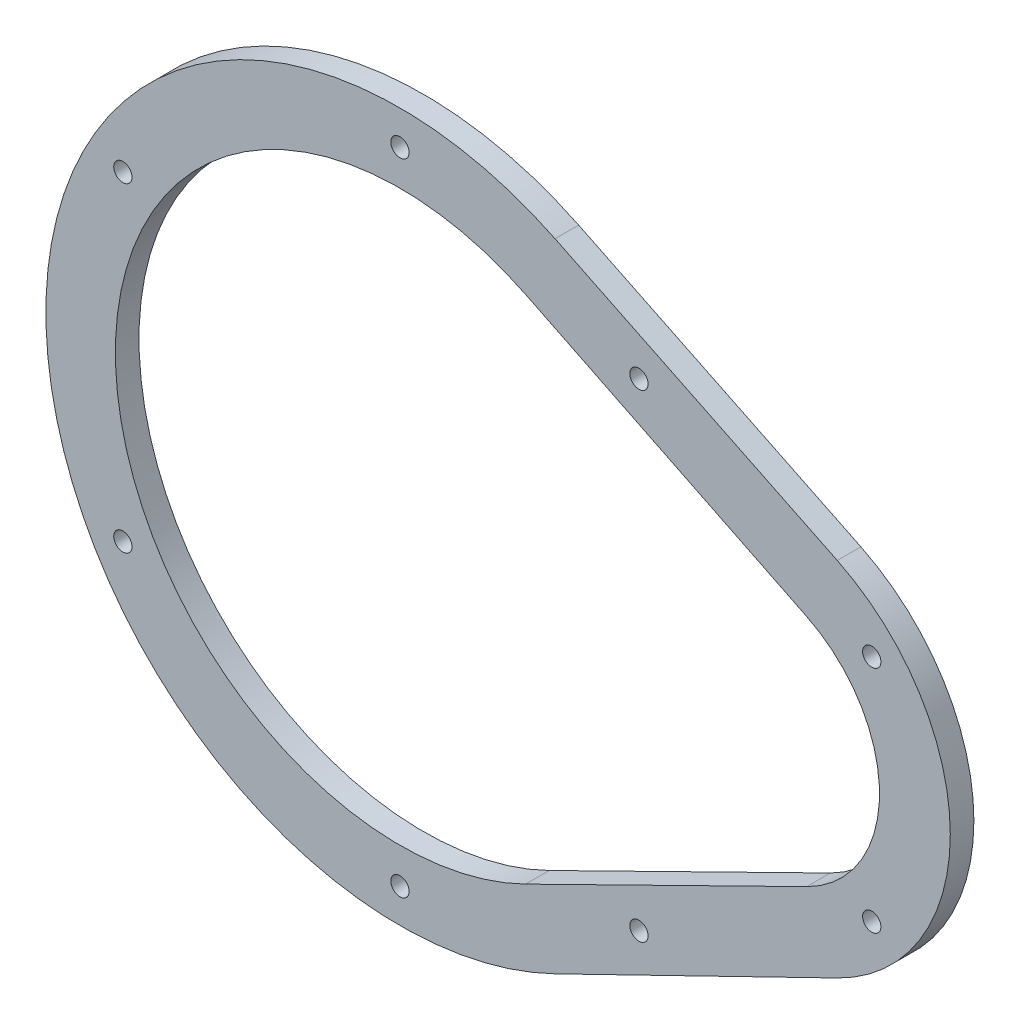
ISO-10303-21;
HEADER;
FILE_DESCRIPTION(('STEP AP214'),'2;1');
FILE_NAME('part.step','',(''),(''),'','','');
FILE_SCHEMA(('AUTOMOTIVE_DESIGN { 1 0 10303 214 1 1 1 1 }'));
ENDSEC;
DATA;
#1=APPLICATION_CONTEXT('core data for automotive mechanical design processes');
#2=APPLICATION_PROTOCOL_DEFINITION('international standard','automotive_design',2000,#1);
#3=PRODUCT_CONTEXT('',#1,'mechanical');
#4=PRODUCT('Part','Part','',(#3));
#5=PRODUCT_RELATED_PRODUCT_CATEGORY('part','',(#4));
#6=PRODUCT_DEFINITION_FORMATION('','',#4);
#7=PRODUCT_DEFINITION_CONTEXT('part definition',#1,'design');
#8=PRODUCT_DEFINITION('design','',#6,#7);
#9=PRODUCT_DEFINITION_SHAPE('','',#8);
#10=(LENGTH_UNIT() NAMED_UNIT(*) SI_UNIT(.MILLI.,.METRE.));
#11=(NAMED_UNIT(*) PLANE_ANGLE_UNIT() SI_UNIT($,.RADIAN.));
#12=(NAMED_UNIT(*) SI_UNIT($,.STERADIAN.) SOLID_ANGLE_UNIT());
#13=UNCERTAINTY_MEASURE_WITH_UNIT(LENGTH_MEASURE(1.E-05),#10,'distance_accuracy_value','');
#14=(GEOMETRIC_REPRESENTATION_CONTEXT(3) GLOBAL_UNCERTAINTY_ASSIGNED_CONTEXT((#13)) GLOBAL_UNIT_ASSIGNED_CONTEXT((#10,
#11,#12)) REPRESENTATION_CONTEXT('',''));
#15=CARTESIAN_POINT('',(0.,0.,0.));
#16=DIRECTION('',(0.,0.,1.));
#17=DIRECTION('',(1.,0.,0.));
#18=AXIS2_PLACEMENT_3D('',#15,#16,#17);
#19=CARTESIAN_POINT('',(0.,0.,4.));
#20=DIRECTION('',(0.,0.,1.));
#21=DIRECTION('',(1.,0.,0.));
#22=AXIS2_PLACEMENT_3D('',#19,#20,#21);
#23=PLANE('',#22);
#24=CARTESIAN_POINT('',(0.,54.22083333,4.));
#25=DIRECTION('',(0.,0.,1.));
#26=DIRECTION('',(1.,0.,0.));
#27=AXIS2_PLACEMENT_3D('',#24,#25,#26);
#28=CIRCLE('',#27,1.55);
#29=CARTESIAN_POINT('',(1.55,54.22083333,4.));
#30=VERTEX_POINT('',#29);
#31=EDGE_CURVE('E129',#30,#30,#28,.F.);
#32=ORIENTED_EDGE('',*,*,#31,.T.);
#33=EDGE_LOOP('',(#32));
#34=FACE_BOUND('',#33,.T.);
#35=CARTESIAN_POINT('',(40.4981886331445,-40.4981886331446,4.));
#36=DIRECTION('',(0.,0.,1.));
#37=DIRECTION('',(1.,0.,0.));
#38=AXIS2_PLACEMENT_3D('',#35,#36,#37);
#39=CIRCLE('',#38,1.55);
#40=CARTESIAN_POINT('',(42.0481886331445,-40.4981886331446,4.));
#41=VERTEX_POINT('',#40);
#42=EDGE_CURVE('E298',#41,#41,#39,.F.);
#43=ORIENTED_EDGE('',*,*,#42,.T.);
#44=EDGE_LOOP('',(#43));
#45=FACE_BOUND('',#44,.T.);
#46=CARTESIAN_POINT('',(40.4981886331445,40.4981886331446,4.));
#47=DIRECTION('',(0.,0.,1.));
#48=DIRECTION('',(1.,0.,0.));
#49=AXIS2_PLACEMENT_3D('',#46,#47,#48);
#50=CIRCLE('',#49,1.55);
#51=CARTESIAN_POINT('',(42.0481886331445,40.4981886331446,4.));
#52=VERTEX_POINT('',#51);
#53=EDGE_CURVE('E295',#52,#52,#50,.F.);
#54=ORIENTED_EDGE('',*,*,#53,.T.);
#55=EDGE_LOOP('',(#54));
#56=FACE_BOUND('',#55,.T.);
#57=CARTESIAN_POINT('',(79.94543648263,-19.4454364826301,4.));
#58=DIRECTION('',(0.,0.,1.));
#59=DIRECTION('',(1.,0.,0.));
#60=AXIS2_PLACEMENT_3D('',#57,#58,#59);
#61=CIRCLE('',#60,1.54999999999999);
#62=CARTESIAN_POINT('',(81.49543648263,-19.4454364826301,4.));
#63=VERTEX_POINT('',#62);
#64=EDGE_CURVE('E292',#63,#63,#61,.F.);
#65=ORIENTED_EDGE('',*,*,#64,.T.);
#66=EDGE_LOOP('',(#65));
#67=FACE_BOUND('',#66,.T.);
#68=CARTESIAN_POINT('',(1.94790818854248E-12,-54.2208333300005,4.));
#69=DIRECTION('',(0.,0.,1.));
#70=DIRECTION('',(1.,0.,0.));
#71=AXIS2_PLACEMENT_3D('',#68,#69,#70);
#72=CIRCLE('',#71,1.55000000000135);
#73=CARTESIAN_POINT('',(1.55000000000329,-54.2208333300005,4.));
#74=VERTEX_POINT('',#73);
#75=EDGE_CURVE('E289',#74,#74,#72,.F.);
#76=ORIENTED_EDGE('',*,*,#75,.T.);
#77=EDGE_LOOP('',(#76));
#78=FACE_BOUND('',#77,.T.);
#79=CARTESIAN_POINT('',(-46.9566190781388,-27.1104166650002,4.));
#80=DIRECTION('',(0.,0.,1.));
#81=DIRECTION('',(1.,0.,0.));
#82=AXIS2_PLACEMENT_3D('',#79,#80,#81);
#83=CIRCLE('',#82,1.55000000000226);
#84=CARTESIAN_POINT('',(-45.4066190781365,-27.1104166650002,4.));
#85=VERTEX_POINT('',#84);
#86=EDGE_CURVE('E286',#85,#85,#83,.F.);
#87=ORIENTED_EDGE('',*,*,#86,.T.);
#88=EDGE_LOOP('',(#87));
#89=FACE_BOUND('',#88,.T.);
#90=CARTESIAN_POINT('',(-46.9566190781398,27.1104166649986,4.));
#91=DIRECTION('',(0.,0.,1.));
#92=DIRECTION('',(1.,0.,0.));
#93=AXIS2_PLACEMENT_3D('',#90,#91,#92);
#94=CIRCLE('',#93,1.55000000000079);
#95=CARTESIAN_POINT('',(-45.406619078139,27.1104166649986,4.));
#96=VERTEX_POINT('',#95);
#97=EDGE_CURVE('E261',#96,#96,#94,.F.);
#98=ORIENTED_EDGE('',*,*,#97,.T.);
#99=EDGE_LOOP('',(#98));
#100=FACE_BOUND('',#99,.T.);
#101=CARTESIAN_POINT('',(79.94543648263,19.4454364826301,4.));
#102=DIRECTION('',(0.,0.,1.));
#103=DIRECTION('',(1.,0.,0.));
#104=AXIS2_PLACEMENT_3D('',#101,#102,#103);
#105=CIRCLE('',#104,1.54999999999999);
#106=CARTESIAN_POINT('',(81.49543648263,19.4454364826301,4.));
#107=VERTEX_POINT('',#106);
#108=EDGE_CURVE('E257',#107,#107,#105,.F.);
#109=ORIENTED_EDGE('',*,*,#108,.T.);
#110=EDGE_LOOP('',(#109));
#111=FACE_BOUND('',#110,.T.);
#112=CARTESIAN_POINT('',(0.,0.,4.));
#113=DIRECTION('',(0.,0.,1.));
#114=DIRECTION('',(1.,0.,0.));
#115=AXIS2_PLACEMENT_3D('',#112,#113,#114);
#116=CIRCLE('',#115,60.);
#117=CARTESIAN_POINT('',(26.2809917355372,53.9380151043457,4.));
#118=VERTEX_POINT('',#117);
#119=CARTESIAN_POINT('',(26.2809917355372,-53.9380151043457,4.));
#120=VERTEX_POINT('',#119);
#121=EDGE_CURVE('E139',#118,#120,#116,.T.);
#122=ORIENTED_EDGE('',*,*,#121,.T.);
#123=DIRECTION('',(0.898966918405762,0.43801652892562,0.));
#124=VECTOR('',#123,1.);
#125=CARTESIAN_POINT('',(26.2809917355372,-53.9380151043457,4.));
#126=LINE('',#125,#124);
#127=CARTESIAN_POINT('',(74.1027662046278,-30.6371269057431,4.));
#128=VERTEX_POINT('',#127);
#129=EDGE_CURVE('E142',#120,#128,#126,.T.);
#130=ORIENTED_EDGE('',*,*,#129,.T.);
#131=CARTESIAN_POINT('',(59.1750000001653,0.,4.));
#132=DIRECTION('',(0.,0.,1.));
#133=DIRECTION('',(-1.,0.,0.));
#134=AXIS2_PLACEMENT_3D('',#131,#132,#133);
#135=CIRCLE('',#134,34.080371900754);
#136=CARTESIAN_POINT('',(74.1027662046278,30.6371269057431,4.));
#137=VERTEX_POINT('',#136);
#138=EDGE_CURVE('E145',#128,#137,#135,.T.);
#139=ORIENTED_EDGE('',*,*,#138,.T.);
#140=DIRECTION('',(-0.898966918405761,0.43801652892562,0.));
#141=VECTOR('',#140,1.);
#142=CARTESIAN_POINT('',(26.2809917355372,53.9380151043457,4.));
#143=LINE('',#142,#141);
#144=EDGE_CURVE('E147',#137,#118,#143,.T.);
#145=ORIENTED_EDGE('',*,*,#144,.T.);
#146=EDGE_LOOP('',(#122,#130,#139,#145));
#147=FACE_BOUND('',#146,.T.);
#148=DIRECTION('',(0.897179221562907,0.441666666611571,0.));
#149=VECTOR('',#148,1.);
#150=CARTESIAN_POINT('',(21.2975347180932,-43.2627297101241,4.));
#151=LINE('',#150,#149);
#152=CARTESIAN_POINT('',(21.2975347180932,-43.2627297101241,4.));
#153=VERTEX_POINT('',#152);
#154=CARTESIAN_POINT('',(68.9293003461062,-19.8143900204236,4.));
#155=VERTEX_POINT('',#154);
#156=EDGE_CURVE('E109',#153,#155,#151,.T.);
#157=ORIENTED_EDGE('',*,*,#156,.F.);
#158=CARTESIAN_POINT('',(0.,0.,4.));
#159=DIRECTION('',(0.,0.,1.));
#160=DIRECTION('',(1.,0.,0.));
#161=AXIS2_PLACEMENT_3D('',#158,#159,#160);
#162=CIRCLE('',#161,48.22083333);
#163=CARTESIAN_POINT('',(21.2975347180932,43.2627297101241,4.));
#164=VERTEX_POINT('',#163);
#165=EDGE_CURVE('E101',#164,#153,#162,.T.);
#166=ORIENTED_EDGE('',*,*,#165,.F.);
#167=DIRECTION('',(-0.897179221562907,0.441666666611571,0.));
#168=VECTOR('',#167,1.);
#169=CARTESIAN_POINT('',(21.2975347180932,43.2627297101241,4.));
#170=LINE('',#169,#168);
#171=CARTESIAN_POINT('',(68.9293003461062,19.8143900204236,4.));
#172=VERTEX_POINT('',#171);
#173=EDGE_CURVE('E123',#172,#164,#170,.T.);
#174=ORIENTED_EDGE('',*,*,#173,.F.);
#175=CARTESIAN_POINT('',(59.1750000001653,0.,4.));
#176=DIRECTION('',(0.,0.,1.));
#177=DIRECTION('',(-1.,0.,0.));
#178=AXIS2_PLACEMENT_3D('',#175,#176,#177);
#179=CIRCLE('',#178,22.0852083331873);
#180=EDGE_CURVE('E121',#155,#172,#179,.T.);
#181=ORIENTED_EDGE('',*,*,#180,.F.);
#182=EDGE_LOOP('',(#157,#166,#174,#181));
#183=FACE_BOUND('',#182,.T.);
#184=ADVANCED_FACE('F36',(#34,#45,#56,#67,#78,#89,#100,#111,#147,#183),#23,.T.);
#185=CARTESIAN_POINT('',(0.,0.,0.));
#186=DIRECTION('',(0.,0.,1.));
#187=DIRECTION('',(1.,0.,0.));
#188=AXIS2_PLACEMENT_3D('',#185,#186,#187);
#189=PLANE('',#188);
#190=CARTESIAN_POINT('',(0.,54.22083333,0.));
#191=DIRECTION('',(0.,0.,1.));
#192=DIRECTION('',(1.,0.,0.));
#193=AXIS2_PLACEMENT_3D('',#190,#191,#192);
#194=CIRCLE('',#193,1.55);
#195=CARTESIAN_POINT('',(1.55,54.22083333,0.));
#196=VERTEX_POINT('',#195);
#197=EDGE_CURVE('E256',#196,#196,#194,.T.);
#198=ORIENTED_EDGE('',*,*,#197,.T.);
#199=EDGE_LOOP('',(#198));
#200=FACE_BOUND('',#199,.T.);
#201=CARTESIAN_POINT('',(40.4981886331445,-40.4981886331446,0.));
#202=DIRECTION('',(0.,0.,1.));
#203=DIRECTION('',(-1.,0.,0.));
#204=AXIS2_PLACEMENT_3D('',#201,#202,#203);
#205=CIRCLE('',#204,1.55);
#206=CARTESIAN_POINT('',(38.9481886331445,-40.4981886331446,0.));
#207=VERTEX_POINT('',#206);
#208=EDGE_CURVE('E274',#207,#207,#205,.T.);
#209=ORIENTED_EDGE('',*,*,#208,.T.);
#210=EDGE_LOOP('',(#209));
#211=FACE_BOUND('',#210,.T.);
#212=CARTESIAN_POINT('',(40.4981886331445,40.4981886331446,0.));
#213=DIRECTION('',(0.,0.,1.));
#214=DIRECTION('',(1.,0.,0.));
#215=AXIS2_PLACEMENT_3D('',#212,#213,#214);
#216=CIRCLE('',#215,1.55);
#217=CARTESIAN_POINT('',(42.0481886331445,40.4981886331446,0.));
#218=VERTEX_POINT('',#217);
#219=EDGE_CURVE('E271',#218,#218,#216,.T.);
#220=ORIENTED_EDGE('',*,*,#219,.T.);
#221=EDGE_LOOP('',(#220));
#222=FACE_BOUND('',#221,.T.);
#223=CARTESIAN_POINT('',(79.94543648263,-19.4454364826301,0.));
#224=DIRECTION('',(0.,0.,1.));
#225=DIRECTION('',(-1.,0.,0.));
#226=AXIS2_PLACEMENT_3D('',#223,#224,#225);
#227=CIRCLE('',#226,1.54999999999999);
#228=CARTESIAN_POINT('',(78.39543648263,-19.4454364826301,0.));
#229=VERTEX_POINT('',#228);
#230=EDGE_CURVE('E267',#229,#229,#227,.T.);
#231=ORIENTED_EDGE('',*,*,#230,.T.);
#232=EDGE_LOOP('',(#231));
#233=FACE_BOUND('',#232,.T.);
#234=CARTESIAN_POINT('',(1.94790818854248E-12,-54.2208333300005,0.));
#235=DIRECTION('',(0.,0.,1.));
#236=DIRECTION('',(1.,0.,0.));
#237=AXIS2_PLACEMENT_3D('',#234,#235,#236);
#238=CIRCLE('',#237,1.55000000000135);
#239=CARTESIAN_POINT('',(1.55000000000329,-54.2208333300005,0.));
#240=VERTEX_POINT('',#239);
#241=EDGE_CURVE('E270',#240,#240,#238,.T.);
#242=ORIENTED_EDGE('',*,*,#241,.T.);
#243=EDGE_LOOP('',(#242));
#244=FACE_BOUND('',#243,.T.);
#245=CARTESIAN_POINT('',(-46.9566190781388,-27.1104166650002,0.));
#246=DIRECTION('',(0.,0.,1.));
#247=DIRECTION('',(1.,0.,0.));
#248=AXIS2_PLACEMENT_3D('',#245,#246,#247);
#249=CIRCLE('',#248,1.55000000000226);
#250=CARTESIAN_POINT('',(-45.4066190781365,-27.1104166650002,0.));
#251=VERTEX_POINT('',#250);
#252=EDGE_CURVE('E279',#251,#251,#249,.T.);
#253=ORIENTED_EDGE('',*,*,#252,.T.);
#254=EDGE_LOOP('',(#253));
#255=FACE_BOUND('',#254,.T.);
#256=CARTESIAN_POINT('',(-46.9566190781398,27.1104166649986,0.));
#257=DIRECTION('',(0.,0.,1.));
#258=DIRECTION('',(1.,0.,0.));
#259=AXIS2_PLACEMENT_3D('',#256,#257,#258);
#260=CIRCLE('',#259,1.55000000000079);
#261=CARTESIAN_POINT('',(-45.406619078139,27.1104166649986,0.));
#262=VERTEX_POINT('',#261);
#263=EDGE_CURVE('E264',#262,#262,#260,.T.);
#264=ORIENTED_EDGE('',*,*,#263,.T.);
#265=EDGE_LOOP('',(#264));
#266=FACE_BOUND('',#265,.T.);
#267=CARTESIAN_POINT('',(79.94543648263,19.4454364826301,0.));
#268=DIRECTION('',(0.,0.,1.));
#269=DIRECTION('',(1.,0.,0.));
#270=AXIS2_PLACEMENT_3D('',#267,#268,#269);
#271=CIRCLE('',#270,1.54999999999999);
#272=CARTESIAN_POINT('',(81.49543648263,19.4454364826301,0.));
#273=VERTEX_POINT('',#272);
#274=EDGE_CURVE('E258',#273,#273,#271,.T.);
#275=ORIENTED_EDGE('',*,*,#274,.T.);
#276=EDGE_LOOP('',(#275));
#277=FACE_BOUND('',#276,.T.);
#278=CARTESIAN_POINT('',(0.,0.,0.));
#279=DIRECTION('',(0.,0.,1.));
#280=DIRECTION('',(1.,0.,0.));
#281=AXIS2_PLACEMENT_3D('',#278,#279,#280);
#282=CIRCLE('',#281,60.);
#283=CARTESIAN_POINT('',(26.2809917355372,53.9380151043457,0.));
#284=VERTEX_POINT('',#283);
#285=CARTESIAN_POINT('',(26.2809917355372,-53.9380151043457,0.));
#286=VERTEX_POINT('',#285);
#287=EDGE_CURVE('E117',#284,#286,#282,.T.);
#288=ORIENTED_EDGE('',*,*,#287,.F.);
#289=DIRECTION('',(-0.898966918405761,0.43801652892562,0.));
#290=VECTOR('',#289,1.);
#291=CARTESIAN_POINT('',(26.2809917355372,53.9380151043457,0.));
#292=LINE('',#291,#290);
#293=CARTESIAN_POINT('',(74.1027662046278,30.6371269057431,0.));
#294=VERTEX_POINT('',#293);
#295=EDGE_CURVE('E143',#294,#284,#292,.T.);
#296=ORIENTED_EDGE('',*,*,#295,.F.);
#297=CARTESIAN_POINT('',(59.1750000001653,0.,0.));
#298=DIRECTION('',(0.,0.,1.));
#299=DIRECTION('',(-1.,0.,0.));
#300=AXIS2_PLACEMENT_3D('',#297,#298,#299);
#301=CIRCLE('',#300,34.080371900754);
#302=CARTESIAN_POINT('',(74.1027662046278,-30.6371269057431,0.));
#303=VERTEX_POINT('',#302);
#304=EDGE_CURVE('E154',#303,#294,#301,.T.);
#305=ORIENTED_EDGE('',*,*,#304,.F.);
#306=DIRECTION('',(0.898966918405762,0.43801652892562,0.));
#307=VECTOR('',#306,1.);
#308=CARTESIAN_POINT('',(26.2809917355372,-53.9380151043457,0.));
#309=LINE('',#308,#307);
#310=EDGE_CURVE('E152',#286,#303,#309,.T.);
#311=ORIENTED_EDGE('',*,*,#310,.F.);
#312=EDGE_LOOP('',(#288,#296,#305,#311));
#313=FACE_BOUND('',#312,.T.);
#314=CARTESIAN_POINT('',(0.,0.,0.));
#315=DIRECTION('',(0.,0.,1.));
#316=DIRECTION('',(1.,0.,0.));
#317=AXIS2_PLACEMENT_3D('',#314,#315,#316);
#318=CIRCLE('',#317,48.22083333);
#319=CARTESIAN_POINT('',(21.2975347180932,43.2627297101241,0.));
#320=VERTEX_POINT('',#319);
#321=CARTESIAN_POINT('',(21.2975347180932,-43.2627297101241,0.));
#322=VERTEX_POINT('',#321);
#323=EDGE_CURVE('E59',#320,#322,#318,.T.);
#324=ORIENTED_EDGE('',*,*,#323,.T.);
#325=DIRECTION('',(0.897179221562907,0.441666666611571,0.));
#326=VECTOR('',#325,1.);
#327=CARTESIAN_POINT('',(21.2975347180932,-43.2627297101241,0.));
#328=LINE('',#327,#326);
#329=CARTESIAN_POINT('',(68.9293003461062,-19.8143900204236,0.));
#330=VERTEX_POINT('',#329);
#331=EDGE_CURVE('E116',#322,#330,#328,.T.);
#332=ORIENTED_EDGE('',*,*,#331,.T.);
#333=CARTESIAN_POINT('',(59.1750000001653,0.,0.));
#334=DIRECTION('',(0.,0.,1.));
#335=DIRECTION('',(-1.,0.,0.));
#336=AXIS2_PLACEMENT_3D('',#333,#334,#335);
#337=CIRCLE('',#336,22.0852083331873);
#338=CARTESIAN_POINT('',(68.9293003461062,19.8143900204236,0.));
#339=VERTEX_POINT('',#338);
#340=EDGE_CURVE('E131',#330,#339,#337,.T.);
#341=ORIENTED_EDGE('',*,*,#340,.T.);
#342=DIRECTION('',(-0.897179221562907,0.441666666611571,0.));
#343=VECTOR('',#342,1.);
#344=CARTESIAN_POINT('',(21.2975347180932,43.2627297101241,0.));
#345=LINE('',#344,#343);
#346=EDGE_CURVE('E110',#339,#320,#345,.T.);
#347=ORIENTED_EDGE('',*,*,#346,.T.);
#348=EDGE_LOOP('',(#324,#332,#341,#347));
#349=FACE_BOUND('',#348,.T.);
#350=ADVANCED_FACE('F172',(#200,#211,#222,#233,#244,#255,#266,#277,#313,#349),#189,.F.);
#351=CARTESIAN_POINT('',(0.,0.,4.));
#352=DIRECTION('',(0.,0.,-1.));
#353=DIRECTION('',(-1.,0.,0.));
#354=AXIS2_PLACEMENT_3D('',#351,#352,#353);
#355=CYLINDRICAL_SURFACE('',#354,60.);
#356=ORIENTED_EDGE('',*,*,#287,.T.);
#357=DIRECTION('',(0.,0.,-1.));
#358=VECTOR('',#357,1.);
#359=CARTESIAN_POINT('',(26.2809917355372,-53.9380151043457,4.));
#360=LINE('',#359,#358);
#361=EDGE_CURVE('E12',#120,#286,#360,.T.);
#362=ORIENTED_EDGE('',*,*,#361,.F.);
#363=ORIENTED_EDGE('',*,*,#121,.F.);
#364=DIRECTION('',(0.,0.,-1.));
#365=VECTOR('',#364,1.);
#366=CARTESIAN_POINT('',(26.2809917355372,53.9380151043457,4.));
#367=LINE('',#366,#365);
#368=EDGE_CURVE('E149',#118,#284,#367,.T.);
#369=ORIENTED_EDGE('',*,*,#368,.T.);
#370=EDGE_LOOP('',(#356,#362,#363,#369));
#371=FACE_BOUND('',#370,.T.);
#372=ADVANCED_FACE('F38',(#371),#355,.T.);
#373=CARTESIAN_POINT('',(26.2809917355372,-53.9380151043457,4.));
#374=DIRECTION('',(-0.43801652892562,0.898966918405762,0.));
#375=DIRECTION('',(-0.898966918405762,-0.43801652892562,0.));
#376=AXIS2_PLACEMENT_3D('',#373,#374,#375);
#377=PLANE('',#376);
#378=ORIENTED_EDGE('',*,*,#310,.T.);
#379=DIRECTION('',(0.,0.,-1.));
#380=VECTOR('',#379,1.);
#381=CARTESIAN_POINT('',(74.1027662046278,-30.6371269057431,4.));
#382=LINE('',#381,#380);
#383=EDGE_CURVE('E44',#128,#303,#382,.T.);
#384=ORIENTED_EDGE('',*,*,#383,.F.);
#385=ORIENTED_EDGE('',*,*,#129,.F.);
#386=ORIENTED_EDGE('',*,*,#361,.T.);
#387=EDGE_LOOP('',(#378,#384,#385,#386));
#388=FACE_BOUND('',#387,.T.);
#389=ADVANCED_FACE('F182',(#388),#377,.F.);
#390=CARTESIAN_POINT('',(59.1750000001653,0.,4.));
#391=DIRECTION('',(0.,0.,-1.));
#392=DIRECTION('',(-1.,0.,0.));
#393=AXIS2_PLACEMENT_3D('',#390,#391,#392);
#394=CYLINDRICAL_SURFACE('',#393,34.080371900754);
#395=ORIENTED_EDGE('',*,*,#304,.T.);
#396=DIRECTION('',(0.,0.,-1.));
#397=VECTOR('',#396,1.);
#398=CARTESIAN_POINT('',(74.1027662046278,30.6371269057431,4.));
#399=LINE('',#398,#397);
#400=EDGE_CURVE('E159',#137,#294,#399,.T.);
#401=ORIENTED_EDGE('',*,*,#400,.F.);
#402=ORIENTED_EDGE('',*,*,#138,.F.);
#403=ORIENTED_EDGE('',*,*,#383,.T.);
#404=EDGE_LOOP('',(#395,#401,#402,#403));
#405=FACE_BOUND('',#404,.T.);
#406=ADVANCED_FACE('F166',(#405),#394,.T.);
#407=CARTESIAN_POINT('',(26.2809917355372,53.9380151043457,4.));
#408=DIRECTION('',(-0.43801652892562,-0.898966918405762,0.));
#409=DIRECTION('',(0.898966918405762,-0.43801652892562,0.));
#410=AXIS2_PLACEMENT_3D('',#407,#408,#409);
#411=PLANE('',#410);
#412=ORIENTED_EDGE('',*,*,#295,.T.);
#413=ORIENTED_EDGE('',*,*,#368,.F.);
#414=ORIENTED_EDGE('',*,*,#144,.F.);
#415=ORIENTED_EDGE('',*,*,#400,.T.);
#416=EDGE_LOOP('',(#412,#413,#414,#415));
#417=FACE_BOUND('',#416,.T.);
#418=ADVANCED_FACE('F176',(#417),#411,.F.);
#419=CARTESIAN_POINT('',(0.,0.,4.));
#420=DIRECTION('',(0.,0.,-1.));
#421=DIRECTION('',(-1.,0.,0.));
#422=AXIS2_PLACEMENT_3D('',#419,#420,#421);
#423=CYLINDRICAL_SURFACE('',#422,48.22083333);
#424=ORIENTED_EDGE('',*,*,#323,.F.);
#425=DIRECTION('',(0.,0.,-1.));
#426=VECTOR('',#425,1.);
#427=CARTESIAN_POINT('',(21.2975347180932,43.2627297101241,4.));
#428=LINE('',#427,#426);
#429=EDGE_CURVE('E105',#164,#320,#428,.T.);
#430=ORIENTED_EDGE('',*,*,#429,.F.);
#431=ORIENTED_EDGE('',*,*,#165,.T.);
#432=DIRECTION('',(0.,0.,-1.));
#433=VECTOR('',#432,1.);
#434=CARTESIAN_POINT('',(21.2975347180932,-43.2627297101241,4.));
#435=LINE('',#434,#433);
#436=EDGE_CURVE('E104',#153,#322,#435,.T.);
#437=ORIENTED_EDGE('',*,*,#436,.T.);
#438=EDGE_LOOP('',(#424,#430,#431,#437));
#439=FACE_BOUND('',#438,.T.);
#440=ADVANCED_FACE('F103',(#439),#423,.F.);
#441=CARTESIAN_POINT('',(21.2975347180932,-43.2627297101241,4.));
#442=DIRECTION('',(-0.441666666611571,0.897179221562907,0.));
#443=DIRECTION('',(-0.897179221562907,-0.441666666611571,0.));
#444=AXIS2_PLACEMENT_3D('',#441,#442,#443);
#445=PLANE('',#444);
#446=ORIENTED_EDGE('',*,*,#331,.F.);
#447=ORIENTED_EDGE('',*,*,#436,.F.);
#448=ORIENTED_EDGE('',*,*,#156,.T.);
#449=DIRECTION('',(0.,0.,-1.));
#450=VECTOR('',#449,1.);
#451=CARTESIAN_POINT('',(68.9293003461062,-19.8143900204236,4.));
#452=LINE('',#451,#450);
#453=EDGE_CURVE('E118',#155,#330,#452,.T.);
#454=ORIENTED_EDGE('',*,*,#453,.T.);
#455=EDGE_LOOP('',(#446,#447,#448,#454));
#456=FACE_BOUND('',#455,.T.);
#457=ADVANCED_FACE('F113',(#456),#445,.T.);
#458=CARTESIAN_POINT('',(59.1750000001653,0.,4.));
#459=DIRECTION('',(0.,0.,-1.));
#460=DIRECTION('',(-1.,0.,0.));
#461=AXIS2_PLACEMENT_3D('',#458,#459,#460);
#462=CYLINDRICAL_SURFACE('',#461,22.0852083331873);
#463=ORIENTED_EDGE('',*,*,#340,.F.);
#464=ORIENTED_EDGE('',*,*,#453,.F.);
#465=ORIENTED_EDGE('',*,*,#180,.T.);
#466=DIRECTION('',(0.,0.,-1.));
#467=VECTOR('',#466,1.);
#468=CARTESIAN_POINT('',(68.9293003461062,19.8143900204236,4.));
#469=LINE('',#468,#467);
#470=EDGE_CURVE('E51',#172,#339,#469,.T.);
#471=ORIENTED_EDGE('',*,*,#470,.T.);
#472=EDGE_LOOP('',(#463,#464,#465,#471));
#473=FACE_BOUND('',#472,.T.);
#474=ADVANCED_FACE('F209',(#473),#462,.F.);
#475=CARTESIAN_POINT('',(21.2975347180932,43.2627297101241,4.));
#476=DIRECTION('',(-0.441666666611571,-0.897179221562907,0.));
#477=DIRECTION('',(0.897179221562907,-0.441666666611571,0.));
#478=AXIS2_PLACEMENT_3D('',#475,#476,#477);
#479=PLANE('',#478);
#480=ORIENTED_EDGE('',*,*,#346,.F.);
#481=ORIENTED_EDGE('',*,*,#470,.F.);
#482=ORIENTED_EDGE('',*,*,#173,.T.);
#483=ORIENTED_EDGE('',*,*,#429,.T.);
#484=EDGE_LOOP('',(#480,#481,#482,#483));
#485=FACE_BOUND('',#484,.T.);
#486=ADVANCED_FACE('F213',(#485),#479,.T.);
#487=CARTESIAN_POINT('',(79.94543648263,19.4454364826301,24.384062043363));
#488=DIRECTION('',(0.,0.,-1.));
#489=DIRECTION('',(-1.,0.,0.));
#490=AXIS2_PLACEMENT_3D('',#487,#488,#489);
#491=CYLINDRICAL_SURFACE('',#490,1.54999999999999);
#492=ORIENTED_EDGE('',*,*,#108,.F.);
#493=EDGE_LOOP('',(#492));
#494=FACE_BOUND('',#493,.T.);
#495=ORIENTED_EDGE('',*,*,#274,.F.);
#496=EDGE_LOOP('',(#495));
#497=FACE_BOUND('',#496,.T.);
#498=ADVANCED_FACE('F219',(#494,#497),#491,.F.);
#499=CARTESIAN_POINT('',(-46.9566190781398,27.1104166649986,24.384062043363));
#500=DIRECTION('',(0.,0.,-1.));
#501=DIRECTION('',(-1.,0.,0.));
#502=AXIS2_PLACEMENT_3D('',#499,#500,#501);
#503=CYLINDRICAL_SURFACE('',#502,1.55000000000079);
#504=ORIENTED_EDGE('',*,*,#97,.F.);
#505=EDGE_LOOP('',(#504));
#506=FACE_BOUND('',#505,.T.);
#507=ORIENTED_EDGE('',*,*,#263,.F.);
#508=EDGE_LOOP('',(#507));
#509=FACE_BOUND('',#508,.T.);
#510=ADVANCED_FACE('F228',(#506,#509),#503,.F.);
#511=CARTESIAN_POINT('',(-46.9566190781388,-27.1104166650002,24.384062043363));
#512=DIRECTION('',(0.,0.,-1.));
#513=DIRECTION('',(-1.,0.,0.));
#514=AXIS2_PLACEMENT_3D('',#511,#512,#513);
#515=CYLINDRICAL_SURFACE('',#514,1.55000000000226);
#516=ORIENTED_EDGE('',*,*,#86,.F.);
#517=EDGE_LOOP('',(#516));
#518=FACE_BOUND('',#517,.T.);
#519=ORIENTED_EDGE('',*,*,#252,.F.);
#520=EDGE_LOOP('',(#519));
#521=FACE_BOUND('',#520,.T.);
#522=ADVANCED_FACE('F224',(#518,#521),#515,.F.);
#523=CARTESIAN_POINT('',(1.94790818854248E-12,-54.2208333300005,24.384062043363));
#524=DIRECTION('',(0.,0.,-1.));
#525=DIRECTION('',(-1.,0.,0.));
#526=AXIS2_PLACEMENT_3D('',#523,#524,#525);
#527=CYLINDRICAL_SURFACE('',#526,1.55000000000135);
#528=ORIENTED_EDGE('',*,*,#75,.F.);
#529=EDGE_LOOP('',(#528));
#530=FACE_BOUND('',#529,.T.);
#531=ORIENTED_EDGE('',*,*,#241,.F.);
#532=EDGE_LOOP('',(#531));
#533=FACE_BOUND('',#532,.T.);
#534=ADVANCED_FACE('F220',(#530,#533),#527,.F.);
#535=CARTESIAN_POINT('',(79.94543648263,-19.4454364826301,24.384062043363));
#536=DIRECTION('',(0.,0.,-1.));
#537=DIRECTION('',(-1.,0.,0.));
#538=AXIS2_PLACEMENT_3D('',#535,#536,#537);
#539=CYLINDRICAL_SURFACE('',#538,1.54999999999999);
#540=ORIENTED_EDGE('',*,*,#64,.F.);
#541=EDGE_LOOP('',(#540));
#542=FACE_BOUND('',#541,.T.);
#543=ORIENTED_EDGE('',*,*,#230,.F.);
#544=EDGE_LOOP('',(#543));
#545=FACE_BOUND('',#544,.T.);
#546=ADVANCED_FACE('F223',(#542,#545),#539,.F.);
#547=CARTESIAN_POINT('',(40.4981886331445,40.4981886331446,24.384062043363));
#548=DIRECTION('',(0.,0.,-1.));
#549=DIRECTION('',(-1.,0.,0.));
#550=AXIS2_PLACEMENT_3D('',#547,#548,#549);
#551=CYLINDRICAL_SURFACE('',#550,1.55);
#552=ORIENTED_EDGE('',*,*,#53,.F.);
#553=EDGE_LOOP('',(#552));
#554=FACE_BOUND('',#553,.T.);
#555=ORIENTED_EDGE('',*,*,#219,.F.);
#556=EDGE_LOOP('',(#555));
#557=FACE_BOUND('',#556,.T.);
#558=ADVANCED_FACE('F240',(#554,#557),#551,.F.);
#559=CARTESIAN_POINT('',(40.4981886331445,-40.4981886331446,24.384062043363));
#560=DIRECTION('',(0.,0.,-1.));
#561=DIRECTION('',(-1.,0.,0.));
#562=AXIS2_PLACEMENT_3D('',#559,#560,#561);
#563=CYLINDRICAL_SURFACE('',#562,1.55);
#564=ORIENTED_EDGE('',*,*,#42,.F.);
#565=EDGE_LOOP('',(#564));
#566=FACE_BOUND('',#565,.T.);
#567=ORIENTED_EDGE('',*,*,#208,.F.);
#568=EDGE_LOOP('',(#567));
#569=FACE_BOUND('',#568,.T.);
#570=ADVANCED_FACE('F236',(#566,#569),#563,.F.);
#571=CARTESIAN_POINT('',(0.,54.22083333,24.384062043363));
#572=DIRECTION('',(0.,0.,-1.));
#573=DIRECTION('',(-1.,0.,0.));
#574=AXIS2_PLACEMENT_3D('',#571,#572,#573);
#575=CYLINDRICAL_SURFACE('',#574,1.55);
#576=ORIENTED_EDGE('',*,*,#31,.F.);
#577=EDGE_LOOP('',(#576));
#578=FACE_BOUND('',#577,.T.);
#579=ORIENTED_EDGE('',*,*,#197,.F.);
#580=EDGE_LOOP('',(#579));
#581=FACE_BOUND('',#580,.T.);
#582=ADVANCED_FACE('F239',(#578,#581),#575,.F.);
#583=CLOSED_SHELL('',(#184,#350,#372,#389,#406,#418,#440,#457,#474,#486,#498,#510,#522,#534,
#546,#558,#570,#582));
#584=MANIFOLD_SOLID_BREP('B2',#583);
#585=ADVANCED_BREP_SHAPE_REPRESENTATION('',(#18,#584),#14);
#586=SHAPE_DEFINITION_REPRESENTATION(#9,#585);
ENDSEC;
END-ISO-10303-21;
